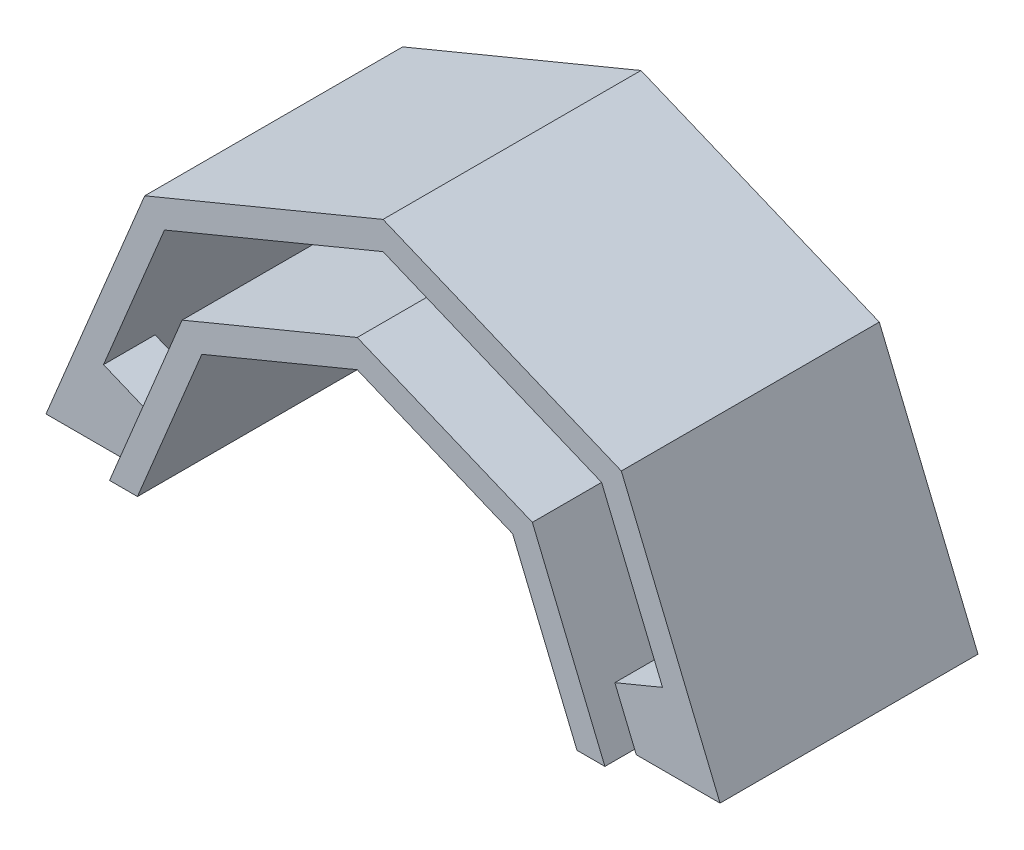
ISO-10303-21;
HEADER;
FILE_DESCRIPTION(('STEP AP214'),'2;1');
FILE_NAME('part.step','',(''),(''),'','','');
FILE_SCHEMA(('AUTOMOTIVE_DESIGN { 1 0 10303 214 1 1 1 1 }'));
ENDSEC;
DATA;
#1=APPLICATION_CONTEXT('core data for automotive mechanical design processes');
#2=APPLICATION_PROTOCOL_DEFINITION('international standard','automotive_design',2000,#1);
#3=PRODUCT_CONTEXT('',#1,'mechanical');
#4=PRODUCT('Part','Part','',(#3));
#5=PRODUCT_RELATED_PRODUCT_CATEGORY('part','',(#4));
#6=PRODUCT_DEFINITION_FORMATION('','',#4);
#7=PRODUCT_DEFINITION_CONTEXT('part definition',#1,'design');
#8=PRODUCT_DEFINITION('design','',#6,#7);
#9=PRODUCT_DEFINITION_SHAPE('','',#8);
#10=(LENGTH_UNIT() NAMED_UNIT(*) SI_UNIT(.MILLI.,.METRE.));
#11=(NAMED_UNIT(*) PLANE_ANGLE_UNIT() SI_UNIT($,.RADIAN.));
#12=(NAMED_UNIT(*) SI_UNIT($,.STERADIAN.) SOLID_ANGLE_UNIT());
#13=UNCERTAINTY_MEASURE_WITH_UNIT(LENGTH_MEASURE(1.E-05),#10,'distance_accuracy_value','');
#14=(GEOMETRIC_REPRESENTATION_CONTEXT(3) GLOBAL_UNCERTAINTY_ASSIGNED_CONTEXT((#13)) GLOBAL_UNIT_ASSIGNED_CONTEXT((#10,
#11,#12)) REPRESENTATION_CONTEXT('',''));
#15=CARTESIAN_POINT('',(0.,0.,0.));
#16=DIRECTION('',(0.,0.,1.));
#17=DIRECTION('',(1.,0.,0.));
#18=AXIS2_PLACEMENT_3D('',#15,#16,#17);
#19=CARTESIAN_POINT('',(0.,0.,2.54));
#20=DIRECTION('',(0.,0.,1.));
#21=DIRECTION('',(1.,0.,0.));
#22=AXIS2_PLACEMENT_3D('',#19,#20,#21);
#23=PLANE('',#22);
#24=DIRECTION('',(-1.,0.,0.));
#25=VECTOR('',#24,1.);
#26=CARTESIAN_POINT('',(-21.6397393151408,0.,2.54));
#27=LINE('',#26,#25);
#28=CARTESIAN_POINT('',(-21.6397393151408,0.,2.54));
#29=VERTEX_POINT('',#28);
#30=CARTESIAN_POINT('',(-29.8875678813688,0.,2.54));
#31=VERTEX_POINT('',#30);
#32=EDGE_CURVE('E251',#29,#31,#27,.T.);
#33=ORIENTED_EDGE('',*,*,#32,.T.);
#34=DIRECTION('',(0.382683432365091,0.923879532511286,0.));
#35=VECTOR('',#34,1.);
#36=CARTESIAN_POINT('',(-30.4725547276914,-1.41228317820205,2.54));
#37=LINE('',#36,#35);
#38=CARTESIAN_POINT('',(-27.0520445619796,6.84555885409439,2.54));
#39=VERTEX_POINT('',#38);
#40=EDGE_CURVE('E66',#31,#39,#37,.T.);
#41=ORIENTED_EDGE('',*,*,#40,.T.);
#42=DIRECTION('',(0.923879532511287,-0.38268343236509,0.));
#43=VECTOR('',#42,1.);
#44=CARTESIAN_POINT('',(-1.54140966025071,-3.72129210695017,2.54));
#45=LINE('',#44,#43);
#46=CARTESIAN_POINT('',(-22.3587365368223,4.90152701767973,2.54));
#47=VERTEX_POINT('',#46);
#48=EDGE_CURVE('E197',#39,#47,#45,.T.);
#49=ORIENTED_EDGE('',*,*,#48,.T.);
#50=DIRECTION('',(-0.38268343236509,-0.923879532511287,0.));
#51=VECTOR('',#50,1.);
#52=CARTESIAN_POINT('',(-17.2456382492599,17.2456382492598,2.54));
#53=LINE('',#52,#51);
#54=CARTESIAN_POINT('',(-17.2456382492599,17.2456382492598,2.54));
#55=VERTEX_POINT('',#54);
#56=EDGE_CURVE('E249',#55,#47,#53,.T.);
#57=ORIENTED_EDGE('',*,*,#56,.F.);
#58=DIRECTION('',(-0.923879532511285,-0.382683432365094,0.));
#59=VECTOR('',#58,1.);
#60=CARTESIAN_POINT('',(-1.21647483752874E-13,24.3890155038835,2.54));
#61=LINE('',#60,#59);
#62=CARTESIAN_POINT('',(-1.21647483752874E-13,24.3890155038835,2.54));
#63=VERTEX_POINT('',#62);
#64=EDGE_CURVE('E247',#63,#55,#61,.T.);
#65=ORIENTED_EDGE('',*,*,#64,.F.);
#66=DIRECTION('',(-0.923879532511286,0.382683432365091,0.));
#67=VECTOR('',#66,1.);
#68=CARTESIAN_POINT('',(17.2456382492597,17.2456382492598,2.54));
#69=LINE('',#68,#67);
#70=CARTESIAN_POINT('',(17.2456382492597,17.2456382492598,2.54));
#71=VERTEX_POINT('',#70);
#72=EDGE_CURVE('E245',#71,#63,#69,.T.);
#73=ORIENTED_EDGE('',*,*,#72,.F.);
#74=DIRECTION('',(-0.382683432365091,0.923879532511287,0.));
#75=VECTOR('',#74,1.);
#76=CARTESIAN_POINT('',(24.3890155038834,0.,2.54));
#77=LINE('',#76,#75);
#78=CARTESIAN_POINT('',(22.3587365368223,4.90152701767973,2.54));
#79=VERTEX_POINT('',#78);
#80=EDGE_CURVE('E243',#79,#71,#77,.T.);
#81=ORIENTED_EDGE('',*,*,#80,.F.);
#82=DIRECTION('',(-0.923879532511287,-0.38268343236509,0.));
#83=VECTOR('',#82,1.);
#84=CARTESIAN_POINT('',(1.54140966025071,-3.72129210695017,2.54));
#85=LINE('',#84,#83);
#86=CARTESIAN_POINT('',(27.0520445619796,6.84555885409439,2.54));
#87=VERTEX_POINT('',#86);
#88=EDGE_CURVE('E205',#87,#79,#85,.T.);
#89=ORIENTED_EDGE('',*,*,#88,.F.);
#90=DIRECTION('',(-0.382683432365091,0.923879532511286,0.));
#91=VECTOR('',#90,1.);
#92=CARTESIAN_POINT('',(30.4725547276914,-1.41228317820205,2.54));
#93=LINE('',#92,#91);
#94=CARTESIAN_POINT('',(29.8875678813688,0.,2.54));
#95=VERTEX_POINT('',#94);
#96=EDGE_CURVE('E210',#95,#87,#93,.T.);
#97=ORIENTED_EDGE('',*,*,#96,.F.);
#98=DIRECTION('',(1.,0.,0.));
#99=VECTOR('',#98,1.);
#100=CARTESIAN_POINT('',(21.6397393151407,0.,2.54));
#101=LINE('',#100,#99);
#102=CARTESIAN_POINT('',(21.6397393151407,0.,2.54));
#103=VERTEX_POINT('',#102);
#104=EDGE_CURVE('E212',#103,#95,#101,.T.);
#105=ORIENTED_EDGE('',*,*,#104,.F.);
#106=DIRECTION('',(-0.382683432365091,0.923879532511286,0.));
#107=VECTOR('',#106,1.);
#108=CARTESIAN_POINT('',(21.6397393151407,0.,2.54));
#109=LINE('',#108,#107);
#110=CARTESIAN_POINT('',(15.3016064128451,15.3016064128452,2.54));
#111=VERTEX_POINT('',#110);
#112=EDGE_CURVE('E219',#103,#111,#109,.T.);
#113=ORIENTED_EDGE('',*,*,#112,.T.);
#114=DIRECTION('',(-0.923879532511286,0.382683432365091,0.));
#115=VECTOR('',#114,1.);
#116=CARTESIAN_POINT('',(15.3016064128451,15.3016064128452,2.54));
#117=LINE('',#116,#115);
#118=CARTESIAN_POINT('',(-1.16443313324943E-13,21.6397393151408,2.54));
#119=VERTEX_POINT('',#118);
#120=EDGE_CURVE('E259',#111,#119,#117,.T.);
#121=ORIENTED_EDGE('',*,*,#120,.T.);
#122=DIRECTION('',(-0.923879532511285,-0.382683432365093,0.));
#123=VECTOR('',#122,1.);
#124=CARTESIAN_POINT('',(-1.16443313324943E-13,21.6397393151408,2.54));
#125=LINE('',#124,#123);
#126=CARTESIAN_POINT('',(-15.3016064128452,15.3016064128452,2.54));
#127=VERTEX_POINT('',#126);
#128=EDGE_CURVE('E256',#119,#127,#125,.T.);
#129=ORIENTED_EDGE('',*,*,#128,.T.);
#130=DIRECTION('',(-0.38268343236509,-0.923879532511287,0.));
#131=VECTOR('',#130,1.);
#132=CARTESIAN_POINT('',(-15.3016064128452,15.3016064128452,2.54));
#133=LINE('',#132,#131);
#134=EDGE_CURVE('E253',#127,#29,#133,.T.);
#135=ORIENTED_EDGE('',*,*,#134,.T.);
#136=EDGE_LOOP('',(#33,#41,#49,#57,#65,#73,#81,#89,#97,#105,#113,#121,#129,#135));
#137=FACE_BOUND('',#136,.T.);
#138=ADVANCED_FACE('F51',(#137),#23,.F.);
#139=CARTESIAN_POINT('',(-30.4725547276914,-1.41228317820205,7.62));
#140=DIRECTION('',(0.,0.,-1.));
#141=DIRECTION('',(-1.,0.,0.));
#142=AXIS2_PLACEMENT_3D('',#139,#140,#141);
#143=PLANE('',#142);
#144=DIRECTION('',(1.,0.,0.));
#145=VECTOR('',#144,1.);
#146=CARTESIAN_POINT('',(-30.9213154832246,0.,7.62));
#147=LINE('',#146,#145);
#148=CARTESIAN_POINT('',(-29.8875678813688,0.,7.62));
#149=VERTEX_POINT('',#148);
#150=CARTESIAN_POINT('',(-24.3890155038834,0.,7.62));
#151=VERTEX_POINT('',#150);
#152=EDGE_CURVE('E167',#149,#151,#147,.T.);
#153=ORIENTED_EDGE('',*,*,#152,.T.);
#154=DIRECTION('',(0.382683432365091,0.923879532511286,0.));
#155=VECTOR('',#154,1.);
#156=CARTESIAN_POINT('',(-25.7792467025341,-3.35631501461671,7.62));
#157=LINE('',#156,#155);
#158=CARTESIAN_POINT('',(-22.3587365368223,4.90152701767973,7.62));
#159=VERTEX_POINT('',#158);
#160=EDGE_CURVE('E193',#151,#159,#157,.T.);
#161=ORIENTED_EDGE('',*,*,#160,.T.);
#162=DIRECTION('',(0.923879532511287,-0.38268343236509,0.));
#163=VECTOR('',#162,1.);
#164=CARTESIAN_POINT('',(-27.5213753644954,7.03996203773587,7.62));
#165=LINE('',#164,#163);
#166=CARTESIAN_POINT('',(-27.0520445619796,6.84555885409439,7.62));
#167=VERTEX_POINT('',#166);
#168=EDGE_CURVE('E184',#167,#159,#165,.T.);
#169=ORIENTED_EDGE('',*,*,#168,.F.);
#170=DIRECTION('',(0.382683432365091,0.923879532511286,0.));
#171=VECTOR('',#170,1.);
#172=CARTESIAN_POINT('',(-30.4725547276914,-1.41228317820205,7.62));
#173=LINE('',#172,#171);
#174=EDGE_CURVE('E182',#149,#167,#173,.T.);
#175=ORIENTED_EDGE('',*,*,#174,.F.);
#176=EDGE_LOOP('',(#153,#161,#169,#175));
#177=FACE_BOUND('',#176,.T.);
#178=ADVANCED_FACE('F187',(#177),#143,.F.);
#179=CARTESIAN_POINT('',(-25.5106349017289,10.5668509610446,0.));
#180=DIRECTION('',(0.923879532511286,-0.382683432365091,0.));
#181=DIRECTION('',(-0.382683432365091,-0.923879532511286,0.));
#182=AXIS2_PLACEMENT_3D('',#179,#180,#181);
#183=PLANE('',#182);
#184=DIRECTION('',(0.,0.,-1.));
#185=VECTOR('',#184,1.);
#186=CARTESIAN_POINT('',(-29.8875678813688,0.,0.));
#187=LINE('',#186,#185);
#188=EDGE_CURVE('E171',#149,#31,#187,.T.);
#189=ORIENTED_EDGE('',*,*,#188,.F.);
#190=ORIENTED_EDGE('',*,*,#174,.T.);
#191=DIRECTION('',(0.,0.,-1.));
#192=VECTOR('',#191,1.);
#193=CARTESIAN_POINT('',(-27.0520445619796,6.84555885409439,0.));
#194=LINE('',#193,#192);
#195=EDGE_CURVE('E12',#167,#39,#194,.T.);
#196=ORIENTED_EDGE('',*,*,#195,.T.);
#197=ORIENTED_EDGE('',*,*,#40,.F.);
#198=EDGE_LOOP('',(#189,#190,#196,#197));
#199=FACE_BOUND('',#198,.T.);
#200=ADVANCED_FACE('F181',(#199),#183,.F.);
#201=CARTESIAN_POINT('',(-17.2456382492599,17.2456382492598,27.94));
#202=DIRECTION('',(0.923879532511287,-0.38268343236509,0.));
#203=DIRECTION('',(0.38268343236509,0.923879532511287,0.));
#204=AXIS2_PLACEMENT_3D('',#201,#202,#203);
#205=PLANE('',#204);
#206=ORIENTED_EDGE('',*,*,#56,.T.);
#207=DIRECTION('',(0.,0.,1.));
#208=VECTOR('',#207,1.);
#209=CARTESIAN_POINT('',(-22.3587365368223,4.90152701767973,-34.544));
#210=LINE('',#209,#208);
#211=EDGE_CURVE('E334',#47,#159,#210,.T.);
#212=ORIENTED_EDGE('',*,*,#211,.T.);
#213=ORIENTED_EDGE('',*,*,#160,.F.);
#214=DIRECTION('',(0.,0.,-1.));
#215=VECTOR('',#214,1.);
#216=CARTESIAN_POINT('',(-24.3890155038835,0.,27.94));
#217=LINE('',#216,#215);
#218=CARTESIAN_POINT('',(-24.3890155038835,0.,27.94));
#219=VERTEX_POINT('',#218);
#220=EDGE_CURVE('E174',#219,#151,#217,.T.);
#221=ORIENTED_EDGE('',*,*,#220,.F.);
#222=DIRECTION('',(-0.38268343236509,-0.923879532511287,0.));
#223=VECTOR('',#222,1.);
#224=CARTESIAN_POINT('',(-17.2456382492599,17.2456382492598,27.94));
#225=LINE('',#224,#223);
#226=CARTESIAN_POINT('',(-17.2456382492599,17.2456382492598,27.94));
#227=VERTEX_POINT('',#226);
#228=EDGE_CURVE('E225',#227,#219,#225,.T.);
#229=ORIENTED_EDGE('',*,*,#228,.F.);
#230=DIRECTION('',(0.,0.,-1.));
#231=VECTOR('',#230,1.);
#232=CARTESIAN_POINT('',(-17.2456382492599,17.2456382492598,27.94));
#233=LINE('',#232,#231);
#234=EDGE_CURVE('E274',#227,#55,#233,.T.);
#235=ORIENTED_EDGE('',*,*,#234,.T.);
#236=EDGE_LOOP('',(#206,#212,#213,#221,#229,#235));
#237=FACE_BOUND('',#236,.T.);
#238=ADVANCED_FACE('F332',(#237),#205,.F.);
#239=CARTESIAN_POINT('',(30.4725547276914,-1.41228317820205,7.62));
#240=DIRECTION('',(0.,0.,1.));
#241=DIRECTION('',(1.,0.,0.));
#242=AXIS2_PLACEMENT_3D('',#239,#240,#241);
#243=PLANE('',#242);
#244=DIRECTION('',(-1.,0.,0.));
#245=VECTOR('',#244,1.);
#246=CARTESIAN_POINT('',(30.9213154832246,0.,7.62));
#247=LINE('',#246,#245);
#248=CARTESIAN_POINT('',(29.8875678813688,0.,7.62));
#249=VERTEX_POINT('',#248);
#250=CARTESIAN_POINT('',(24.3890155038834,0.,7.62));
#251=VERTEX_POINT('',#250);
#252=EDGE_CURVE('E189',#249,#251,#247,.T.);
#253=ORIENTED_EDGE('',*,*,#252,.F.);
#254=DIRECTION('',(-0.382683432365091,0.923879532511286,0.));
#255=VECTOR('',#254,1.);
#256=CARTESIAN_POINT('',(30.4725547276914,-1.41228317820205,7.62));
#257=LINE('',#256,#255);
#258=CARTESIAN_POINT('',(27.0520445619796,6.84555885409439,7.62));
#259=VERTEX_POINT('',#258);
#260=EDGE_CURVE('E74',#249,#259,#257,.T.);
#261=ORIENTED_EDGE('',*,*,#260,.T.);
#262=DIRECTION('',(-0.923879532511287,-0.38268343236509,0.));
#263=VECTOR('',#262,1.);
#264=CARTESIAN_POINT('',(27.5213753644954,7.03996203773587,7.62));
#265=LINE('',#264,#263);
#266=CARTESIAN_POINT('',(22.3587365368223,4.90152701767973,7.62));
#267=VERTEX_POINT('',#266);
#268=EDGE_CURVE('E201',#259,#267,#265,.T.);
#269=ORIENTED_EDGE('',*,*,#268,.T.);
#270=DIRECTION('',(-0.382683432365091,0.923879532511286,0.));
#271=VECTOR('',#270,1.);
#272=CARTESIAN_POINT('',(25.7792467025341,-3.35631501461671,7.62));
#273=LINE('',#272,#271);
#274=EDGE_CURVE('E208',#251,#267,#273,.T.);
#275=ORIENTED_EDGE('',*,*,#274,.F.);
#276=EDGE_LOOP('',(#253,#261,#269,#275));
#277=FACE_BOUND('',#276,.T.);
#278=ADVANCED_FACE('F312',(#277),#243,.T.);
#279=CARTESIAN_POINT('',(25.5106349017289,10.5668509610446,0.));
#280=DIRECTION('',(-0.923879532511286,-0.382683432365091,0.));
#281=DIRECTION('',(0.382683432365091,-0.923879532511286,0.));
#282=AXIS2_PLACEMENT_3D('',#279,#280,#281);
#283=PLANE('',#282);
#284=ORIENTED_EDGE('',*,*,#260,.F.);
#285=DIRECTION('',(0.,0.,-1.));
#286=VECTOR('',#285,1.);
#287=CARTESIAN_POINT('',(29.8875678813688,0.,0.));
#288=LINE('',#287,#286);
#289=EDGE_CURVE('E191',#249,#95,#288,.T.);
#290=ORIENTED_EDGE('',*,*,#289,.T.);
#291=ORIENTED_EDGE('',*,*,#96,.T.);
#292=DIRECTION('',(0.,0.,-1.));
#293=VECTOR('',#292,1.);
#294=CARTESIAN_POINT('',(27.0520445619796,6.84555885409439,0.));
#295=LINE('',#294,#293);
#296=EDGE_CURVE('E59',#259,#87,#295,.T.);
#297=ORIENTED_EDGE('',*,*,#296,.F.);
#298=EDGE_LOOP('',(#284,#290,#291,#297));
#299=FACE_BOUND('',#298,.T.);
#300=ADVANCED_FACE('F313',(#299),#283,.F.);
#301=CARTESIAN_POINT('',(24.3890155038834,0.,27.94));
#302=DIRECTION('',(-0.923879532511286,-0.382683432365091,0.));
#303=DIRECTION('',(0.382683432365091,-0.923879532511287,0.));
#304=AXIS2_PLACEMENT_3D('',#301,#302,#303);
#305=PLANE('',#304);
#306=ORIENTED_EDGE('',*,*,#80,.T.);
#307=DIRECTION('',(0.,0.,-1.));
#308=VECTOR('',#307,1.);
#309=CARTESIAN_POINT('',(17.2456382492597,17.2456382492598,27.94));
#310=LINE('',#309,#308);
#311=CARTESIAN_POINT('',(17.2456382492597,17.2456382492598,27.94));
#312=VERTEX_POINT('',#311);
#313=EDGE_CURVE('E280',#312,#71,#310,.T.);
#314=ORIENTED_EDGE('',*,*,#313,.F.);
#315=DIRECTION('',(-0.382683432365091,0.923879532511287,0.));
#316=VECTOR('',#315,1.);
#317=CARTESIAN_POINT('',(24.3890155038834,0.,27.94));
#318=LINE('',#317,#316);
#319=CARTESIAN_POINT('',(24.3890155038834,0.,27.94));
#320=VERTEX_POINT('',#319);
#321=EDGE_CURVE('E218',#320,#312,#318,.T.);
#322=ORIENTED_EDGE('',*,*,#321,.F.);
#323=DIRECTION('',(0.,0.,-1.));
#324=VECTOR('',#323,1.);
#325=CARTESIAN_POINT('',(24.3890155038834,0.,27.94));
#326=LINE('',#325,#324);
#327=EDGE_CURVE('E283',#320,#251,#326,.T.);
#328=ORIENTED_EDGE('',*,*,#327,.T.);
#329=ORIENTED_EDGE('',*,*,#274,.T.);
#330=DIRECTION('',(0.,0.,1.));
#331=VECTOR('',#330,1.);
#332=CARTESIAN_POINT('',(22.3587365368223,4.90152701767973,-34.544));
#333=LINE('',#332,#331);
#334=EDGE_CURVE('E203',#79,#267,#333,.T.);
#335=ORIENTED_EDGE('',*,*,#334,.F.);
#336=EDGE_LOOP('',(#306,#314,#322,#328,#329,#335));
#337=FACE_BOUND('',#336,.T.);
#338=ADVANCED_FACE('F298',(#337),#305,.F.);
#339=CARTESIAN_POINT('',(21.6397393151407,0.,27.94));
#340=DIRECTION('',(0.,1.,0.));
#341=DIRECTION('',(0.,0.,1.));
#342=AXIS2_PLACEMENT_3D('',#339,#340,#341);
#343=PLANE('',#342);
#344=ORIENTED_EDGE('',*,*,#104,.T.);
#345=ORIENTED_EDGE('',*,*,#289,.F.);
#346=ORIENTED_EDGE('',*,*,#252,.T.);
#347=ORIENTED_EDGE('',*,*,#327,.F.);
#348=DIRECTION('',(1.,0.,0.));
#349=VECTOR('',#348,1.);
#350=CARTESIAN_POINT('',(21.6397393151407,0.,27.94));
#351=LINE('',#350,#349);
#352=CARTESIAN_POINT('',(21.6397393151407,0.,27.94));
#353=VERTEX_POINT('',#352);
#354=EDGE_CURVE('E215',#353,#320,#351,.T.);
#355=ORIENTED_EDGE('',*,*,#354,.F.);
#356=DIRECTION('',(0.,0.,-1.));
#357=VECTOR('',#356,1.);
#358=CARTESIAN_POINT('',(21.6397393151407,0.,27.94));
#359=LINE('',#358,#357);
#360=EDGE_CURVE('E241',#353,#103,#359,.T.);
#361=ORIENTED_EDGE('',*,*,#360,.T.);
#362=EDGE_LOOP('',(#344,#345,#346,#347,#355,#361));
#363=FACE_BOUND('',#362,.T.);
#364=ADVANCED_FACE('F53',(#363),#343,.F.);
#365=CARTESIAN_POINT('',(17.2456382492597,17.2456382492598,27.94));
#366=DIRECTION('',(-0.382683432365091,-0.923879532511286,0.));
#367=DIRECTION('',(0.923879532511286,-0.382683432365091,0.));
#368=AXIS2_PLACEMENT_3D('',#365,#366,#367);
#369=PLANE('',#368);
#370=ORIENTED_EDGE('',*,*,#72,.T.);
#371=DIRECTION('',(0.,0.,-1.));
#372=VECTOR('',#371,1.);
#373=CARTESIAN_POINT('',(-1.21647483752874E-13,24.3890155038835,27.94));
#374=LINE('',#373,#372);
#375=CARTESIAN_POINT('',(-1.21647483752874E-13,24.3890155038835,27.94));
#376=VERTEX_POINT('',#375);
#377=EDGE_CURVE('E277',#376,#63,#374,.T.);
#378=ORIENTED_EDGE('',*,*,#377,.F.);
#379=DIRECTION('',(-0.923879532511286,0.382683432365091,0.));
#380=VECTOR('',#379,1.);
#381=CARTESIAN_POINT('',(17.2456382492597,17.2456382492598,27.94));
#382=LINE('',#381,#380);
#383=EDGE_CURVE('E221',#312,#376,#382,.T.);
#384=ORIENTED_EDGE('',*,*,#383,.F.);
#385=ORIENTED_EDGE('',*,*,#313,.T.);
#386=EDGE_LOOP('',(#370,#378,#384,#385));
#387=FACE_BOUND('',#386,.T.);
#388=ADVANCED_FACE('F301',(#387),#369,.F.);
#389=CARTESIAN_POINT('',(-1.21647483752874E-13,24.3890155038835,27.94));
#390=DIRECTION('',(0.382683432365093,-0.923879532511285,0.));
#391=DIRECTION('',(0.923879532511285,0.382683432365094,0.));
#392=AXIS2_PLACEMENT_3D('',#389,#390,#391);
#393=PLANE('',#392);
#394=ORIENTED_EDGE('',*,*,#64,.T.);
#395=ORIENTED_EDGE('',*,*,#234,.F.);
#396=DIRECTION('',(-0.923879532511285,-0.382683432365094,0.));
#397=VECTOR('',#396,1.);
#398=CARTESIAN_POINT('',(-1.21647483752874E-13,24.3890155038835,27.94));
#399=LINE('',#398,#397);
#400=EDGE_CURVE('E223',#376,#227,#399,.T.);
#401=ORIENTED_EDGE('',*,*,#400,.F.);
#402=ORIENTED_EDGE('',*,*,#377,.T.);
#403=EDGE_LOOP('',(#394,#395,#401,#402));
#404=FACE_BOUND('',#403,.T.);
#405=ADVANCED_FACE('F341',(#404),#393,.F.);
#406=CARTESIAN_POINT('',(-21.6397393151408,0.,27.94));
#407=DIRECTION('',(0.,-1.,0.));
#408=DIRECTION('',(0.,0.,-1.));
#409=AXIS2_PLACEMENT_3D('',#406,#407,#408);
#410=PLANE('',#409);
#411=ORIENTED_EDGE('',*,*,#32,.F.);
#412=DIRECTION('',(0.,0.,-1.));
#413=VECTOR('',#412,1.);
#414=CARTESIAN_POINT('',(-21.6397393151408,0.,27.94));
#415=LINE('',#414,#413);
#416=CARTESIAN_POINT('',(-21.6397393151408,0.,27.94));
#417=VERTEX_POINT('',#416);
#418=EDGE_CURVE('E271',#417,#29,#415,.T.);
#419=ORIENTED_EDGE('',*,*,#418,.F.);
#420=DIRECTION('',(-1.,0.,0.));
#421=VECTOR('',#420,1.);
#422=CARTESIAN_POINT('',(-21.6397393151408,0.,27.94));
#423=LINE('',#422,#421);
#424=EDGE_CURVE('E227',#417,#219,#423,.T.);
#425=ORIENTED_EDGE('',*,*,#424,.T.);
#426=ORIENTED_EDGE('',*,*,#220,.T.);
#427=ORIENTED_EDGE('',*,*,#152,.F.);
#428=ORIENTED_EDGE('',*,*,#188,.T.);
#429=EDGE_LOOP('',(#411,#419,#425,#426,#427,#428));
#430=FACE_BOUND('',#429,.T.);
#431=ADVANCED_FACE('F170',(#430),#410,.T.);
#432=CARTESIAN_POINT('',(-15.3016064128452,15.3016064128452,27.94));
#433=DIRECTION('',(0.923879532511287,-0.38268343236509,0.));
#434=DIRECTION('',(0.38268343236509,0.923879532511287,0.));
#435=AXIS2_PLACEMENT_3D('',#432,#433,#434);
#436=PLANE('',#435);
#437=ORIENTED_EDGE('',*,*,#134,.F.);
#438=DIRECTION('',(0.,0.,-1.));
#439=VECTOR('',#438,1.);
#440=CARTESIAN_POINT('',(-15.3016064128452,15.3016064128452,27.94));
#441=LINE('',#440,#439);
#442=CARTESIAN_POINT('',(-15.3016064128452,15.3016064128452,27.94));
#443=VERTEX_POINT('',#442);
#444=EDGE_CURVE('E269',#443,#127,#441,.T.);
#445=ORIENTED_EDGE('',*,*,#444,.F.);
#446=DIRECTION('',(-0.38268343236509,-0.923879532511287,0.));
#447=VECTOR('',#446,1.);
#448=CARTESIAN_POINT('',(-15.3016064128452,15.3016064128452,27.94));
#449=LINE('',#448,#447);
#450=EDGE_CURVE('E229',#443,#417,#449,.T.);
#451=ORIENTED_EDGE('',*,*,#450,.T.);
#452=ORIENTED_EDGE('',*,*,#418,.T.);
#453=EDGE_LOOP('',(#437,#445,#451,#452));
#454=FACE_BOUND('',#453,.T.);
#455=ADVANCED_FACE('F328',(#454),#436,.T.);
#456=CARTESIAN_POINT('',(-1.16443313324943E-13,21.6397393151408,27.94));
#457=DIRECTION('',(0.382683432365093,-0.923879532511285,0.));
#458=DIRECTION('',(0.923879532511285,0.382683432365093,0.));
#459=AXIS2_PLACEMENT_3D('',#456,#457,#458);
#460=PLANE('',#459);
#461=ORIENTED_EDGE('',*,*,#128,.F.);
#462=DIRECTION('',(0.,0.,-1.));
#463=VECTOR('',#462,1.);
#464=CARTESIAN_POINT('',(-1.16443313324943E-13,21.6397393151408,27.94));
#465=LINE('',#464,#463);
#466=CARTESIAN_POINT('',(-1.16443313324943E-13,21.6397393151408,27.94));
#467=VERTEX_POINT('',#466);
#468=EDGE_CURVE('E267',#467,#119,#465,.T.);
#469=ORIENTED_EDGE('',*,*,#468,.F.);
#470=DIRECTION('',(-0.923879532511285,-0.382683432365093,0.));
#471=VECTOR('',#470,1.);
#472=CARTESIAN_POINT('',(-1.16443313324943E-13,21.6397393151408,27.94));
#473=LINE('',#472,#471);
#474=EDGE_CURVE('E232',#467,#443,#473,.T.);
#475=ORIENTED_EDGE('',*,*,#474,.T.);
#476=ORIENTED_EDGE('',*,*,#444,.T.);
#477=EDGE_LOOP('',(#461,#469,#475,#476));
#478=FACE_BOUND('',#477,.T.);
#479=ADVANCED_FACE('F324',(#478),#460,.T.);
#480=CARTESIAN_POINT('',(15.3016064128451,15.3016064128452,27.94));
#481=DIRECTION('',(-0.382683432365091,-0.923879532511286,0.));
#482=DIRECTION('',(0.923879532511286,-0.382683432365091,0.));
#483=AXIS2_PLACEMENT_3D('',#480,#481,#482);
#484=PLANE('',#483);
#485=ORIENTED_EDGE('',*,*,#120,.F.);
#486=DIRECTION('',(0.,0.,-1.));
#487=VECTOR('',#486,1.);
#488=CARTESIAN_POINT('',(15.3016064128451,15.3016064128452,27.94));
#489=LINE('',#488,#487);
#490=CARTESIAN_POINT('',(15.3016064128451,15.3016064128452,27.94));
#491=VERTEX_POINT('',#490);
#492=EDGE_CURVE('E265',#491,#111,#489,.T.);
#493=ORIENTED_EDGE('',*,*,#492,.F.);
#494=DIRECTION('',(-0.923879532511286,0.382683432365091,0.));
#495=VECTOR('',#494,1.);
#496=CARTESIAN_POINT('',(15.3016064128451,15.3016064128452,27.94));
#497=LINE('',#496,#495);
#498=EDGE_CURVE('E235',#491,#467,#497,.T.);
#499=ORIENTED_EDGE('',*,*,#498,.T.);
#500=ORIENTED_EDGE('',*,*,#468,.T.);
#501=EDGE_LOOP('',(#485,#493,#499,#500));
#502=FACE_BOUND('',#501,.T.);
#503=ADVANCED_FACE('F320',(#502),#484,.T.);
#504=CARTESIAN_POINT('',(21.6397393151407,0.,27.94));
#505=DIRECTION('',(-0.923879532511286,-0.382683432365091,0.));
#506=DIRECTION('',(0.382683432365091,-0.923879532511286,0.));
#507=AXIS2_PLACEMENT_3D('',#504,#505,#506);
#508=PLANE('',#507);
#509=ORIENTED_EDGE('',*,*,#112,.F.);
#510=ORIENTED_EDGE('',*,*,#360,.F.);
#511=DIRECTION('',(-0.382683432365091,0.923879532511286,0.));
#512=VECTOR('',#511,1.);
#513=CARTESIAN_POINT('',(21.6397393151407,0.,27.94));
#514=LINE('',#513,#512);
#515=EDGE_CURVE('E238',#353,#491,#514,.T.);
#516=ORIENTED_EDGE('',*,*,#515,.T.);
#517=ORIENTED_EDGE('',*,*,#492,.T.);
#518=EDGE_LOOP('',(#509,#510,#516,#517));
#519=FACE_BOUND('',#518,.T.);
#520=ADVANCED_FACE('F316',(#519),#508,.T.);
#521=CARTESIAN_POINT('',(0.,0.,27.94));
#522=DIRECTION('',(0.,0.,1.));
#523=DIRECTION('',(1.,0.,0.));
#524=AXIS2_PLACEMENT_3D('',#521,#522,#523);
#525=PLANE('',#524);
#526=ORIENTED_EDGE('',*,*,#354,.T.);
#527=ORIENTED_EDGE('',*,*,#321,.T.);
#528=ORIENTED_EDGE('',*,*,#383,.T.);
#529=ORIENTED_EDGE('',*,*,#400,.T.);
#530=ORIENTED_EDGE('',*,*,#228,.T.);
#531=ORIENTED_EDGE('',*,*,#424,.F.);
#532=ORIENTED_EDGE('',*,*,#450,.F.);
#533=ORIENTED_EDGE('',*,*,#474,.F.);
#534=ORIENTED_EDGE('',*,*,#498,.F.);
#535=ORIENTED_EDGE('',*,*,#515,.F.);
#536=EDGE_LOOP('',(#526,#527,#528,#529,#530,#531,#532,#533,#534,#535));
#537=FACE_BOUND('',#536,.T.);
#538=ADVANCED_FACE('F305',(#537),#525,.T.);
#539=CARTESIAN_POINT('',(27.5213753644954,7.03996203773587,-34.544));
#540=DIRECTION('',(-0.38268343236509,0.923879532511287,0.));
#541=DIRECTION('',(-0.923879532511287,-0.38268343236509,0.));
#542=AXIS2_PLACEMENT_3D('',#539,#540,#541);
#543=PLANE('',#542);
#544=ORIENTED_EDGE('',*,*,#88,.T.);
#545=ORIENTED_EDGE('',*,*,#334,.T.);
#546=ORIENTED_EDGE('',*,*,#268,.F.);
#547=ORIENTED_EDGE('',*,*,#296,.T.);
#548=EDGE_LOOP('',(#544,#545,#546,#547));
#549=FACE_BOUND('',#548,.T.);
#550=ADVANCED_FACE('F289',(#549),#543,.T.);
#551=CARTESIAN_POINT('',(-27.5213753644954,7.03996203773587,-34.544));
#552=DIRECTION('',(-0.38268343236509,-0.923879532511287,0.));
#553=DIRECTION('',(0.923879532511287,-0.38268343236509,0.));
#554=AXIS2_PLACEMENT_3D('',#551,#552,#553);
#555=PLANE('',#554);
#556=ORIENTED_EDGE('',*,*,#195,.F.);
#557=ORIENTED_EDGE('',*,*,#168,.T.);
#558=ORIENTED_EDGE('',*,*,#211,.F.);
#559=ORIENTED_EDGE('',*,*,#48,.F.);
#560=EDGE_LOOP('',(#556,#557,#558,#559));
#561=FACE_BOUND('',#560,.T.);
#562=ADVANCED_FACE('F338',(#561),#555,.F.);
#563=CLOSED_SHELL('',(#138,#178,#200,#238,#278,#300,#338,#364,#388,#405,#431,#455,#479,#503,
#520,#538,#550,#562));
#564=MANIFOLD_SOLID_BREP('B2',#563);
#565=CARTESIAN_POINT('',(0.,0.,25.4));
#566=DIRECTION('',(0.,0.,1.));
#567=DIRECTION('',(1.,0.,0.));
#568=AXIS2_PLACEMENT_3D('',#565,#566,#567);
#569=PLANE('',#568);
#570=DIRECTION('',(0.382683432365086,-0.923879532511288,0.));
#571=VECTOR('',#570,1.);
#572=CARTESIAN_POINT('',(25.74411509396,-1.94403183641479,25.4));
#573=LINE('',#572,#571);
#574=CARTESIAN_POINT('',(22.828067339338,5.09593020132123,25.4));
#575=VERTEX_POINT('',#574);
#576=CARTESIAN_POINT('',(24.9388707416319,0.,25.4));
#577=VERTEX_POINT('',#576);
#578=EDGE_CURVE('E637',#575,#577,#573,.T.);
#579=ORIENTED_EDGE('',*,*,#578,.T.);
#580=DIRECTION('',(1.,0.,0.));
#581=VECTOR('',#580,1.);
#582=CARTESIAN_POINT('',(30.4374231191173,-1.50042381001198E-13,25.4));
#583=LINE('',#582,#581);
#584=CARTESIAN_POINT('',(33.18669930786,0.,25.4));
#585=VERTEX_POINT('',#584);
#586=EDGE_CURVE('E519',#577,#585,#583,.T.);
#587=ORIENTED_EDGE('',*,*,#586,.T.);
#588=DIRECTION('',(-0.382683432365091,0.923879532511287,0.));
#589=VECTOR('',#588,1.);
#590=CARTESIAN_POINT('',(33.18669930786,0.,25.4));
#591=LINE('',#590,#589);
#592=CARTESIAN_POINT('',(23.4665401257866,23.4665401257867,25.4));
#593=VERTEX_POINT('',#592);
#594=EDGE_CURVE('E673',#585,#593,#591,.T.);
#595=ORIENTED_EDGE('',*,*,#594,.T.);
#596=DIRECTION('',(-0.923879532511286,0.382683432365091,0.));
#597=VECTOR('',#596,1.);
#598=CARTESIAN_POINT('',(23.4665401257866,23.4665401257867,25.4));
#599=LINE('',#598,#597);
#600=CARTESIAN_POINT('',(-1.30646361784503E-13,33.1866993078601,25.4));
#601=VERTEX_POINT('',#600);
#602=EDGE_CURVE('E675',#593,#601,#599,.T.);
#603=ORIENTED_EDGE('',*,*,#602,.T.);
#604=DIRECTION('',(-0.923879532511285,-0.382683432365094,0.));
#605=VECTOR('',#604,1.);
#606=CARTESIAN_POINT('',(-1.30646361784503E-13,33.1866993078601,25.4));
#607=LINE('',#606,#605);
#608=CARTESIAN_POINT('',(-23.4665401257868,23.4665401257867,25.4));
#609=VERTEX_POINT('',#608);
#610=EDGE_CURVE('E677',#601,#609,#607,.T.);
#611=ORIENTED_EDGE('',*,*,#610,.T.);
#612=DIRECTION('',(-0.38268343236509,-0.923879532511287,0.));
#613=VECTOR('',#612,1.);
#614=CARTESIAN_POINT('',(-23.4665401257868,23.4665401257867,25.4));
#615=LINE('',#614,#613);
#616=CARTESIAN_POINT('',(-33.1866993078601,0.,25.4));
#617=VERTEX_POINT('',#616);
#618=EDGE_CURVE('E679',#609,#617,#615,.T.);
#619=ORIENTED_EDGE('',*,*,#618,.T.);
#620=DIRECTION('',(-1.,0.,0.));
#621=VECTOR('',#620,1.);
#622=CARTESIAN_POINT('',(-30.4374231191173,-1.50042381001198E-13,25.4));
#623=LINE('',#622,#621);
#624=CARTESIAN_POINT('',(-24.9388707416319,0.,25.4));
#625=VERTEX_POINT('',#624);
#626=EDGE_CURVE('E681',#625,#617,#623,.T.);
#627=ORIENTED_EDGE('',*,*,#626,.F.);
#628=DIRECTION('',(-0.382683432365086,-0.923879532511288,0.));
#629=VECTOR('',#628,1.);
#630=CARTESIAN_POINT('',(-25.74411509396,-1.94403183641479,25.4));
#631=LINE('',#630,#629);
#632=CARTESIAN_POINT('',(-22.828067339338,5.09593020132123,25.4));
#633=VERTEX_POINT('',#632);
#634=EDGE_CURVE('E653',#633,#625,#631,.T.);
#635=ORIENTED_EDGE('',*,*,#634,.F.);
#636=DIRECTION('',(-0.923879532511289,0.382683432365086,0.));
#637=VECTOR('',#636,1.);
#638=CARTESIAN_POINT('',(-22.828067339338,5.09593020132123,25.4));
#639=LINE('',#638,#637);
#640=CARTESIAN_POINT('',(-27.5213753644954,7.03996203773586,25.4));
#641=VERTEX_POINT('',#640);
#642=EDGE_CURVE('E661',#633,#641,#639,.T.);
#643=ORIENTED_EDGE('',*,*,#642,.T.);
#644=DIRECTION('',(-0.382683432365086,-0.923879532511289,0.));
#645=VECTOR('',#644,1.);
#646=CARTESIAN_POINT('',(-21.5225082893721,21.522508289372,25.4));
#647=LINE('',#646,#645);
#648=CARTESIAN_POINT('',(-21.5225082893721,21.522508289372,25.4));
#649=VERTEX_POINT('',#648);
#650=EDGE_CURVE('E684',#649,#641,#647,.T.);
#651=ORIENTED_EDGE('',*,*,#650,.F.);
#652=DIRECTION('',(-0.923879532511285,-0.382683432365093,0.));
#653=VECTOR('',#652,1.);
#654=CARTESIAN_POINT('',(-1.52764086103208E-13,30.4374231191174,25.4));
#655=LINE('',#654,#653);
#656=CARTESIAN_POINT('',(-1.52764086103208E-13,30.4374231191174,25.4));
#657=VERTEX_POINT('',#656);
#658=EDGE_CURVE('E686',#657,#649,#655,.T.);
#659=ORIENTED_EDGE('',*,*,#658,.F.);
#660=DIRECTION('',(-0.923879532511287,0.38268343236509,0.));
#661=VECTOR('',#660,1.);
#662=CARTESIAN_POINT('',(21.5225082893719,21.5225082893721,25.4));
#663=LINE('',#662,#661);
#664=CARTESIAN_POINT('',(21.5225082893719,21.5225082893721,25.4));
#665=VERTEX_POINT('',#664);
#666=EDGE_CURVE('E689',#665,#657,#663,.T.);
#667=ORIENTED_EDGE('',*,*,#666,.F.);
#668=DIRECTION('',(-0.382683432365093,0.923879532511285,0.));
#669=VECTOR('',#668,1.);
#670=CARTESIAN_POINT('',(30.4374231191173,-1.50042381001198E-13,25.4));
#671=LINE('',#670,#669);
#672=CARTESIAN_POINT('',(27.5213753644954,7.03996203773587,25.4));
#673=VERTEX_POINT('',#672);
#674=EDGE_CURVE('E631',#673,#665,#671,.T.);
#675=ORIENTED_EDGE('',*,*,#674,.F.);
#676=DIRECTION('',(0.923879532511289,0.382683432365086,0.));
#677=VECTOR('',#676,1.);
#678=CARTESIAN_POINT('',(22.828067339338,5.09593020132123,25.4));
#679=LINE('',#678,#677);
#680=EDGE_CURVE('E646',#575,#673,#679,.T.);
#681=ORIENTED_EDGE('',*,*,#680,.F.);
#682=EDGE_LOOP('',(#579,#587,#595,#603,#611,#619,#627,#635,#643,#651,#659,#667,#675,#681));
#683=FACE_BOUND('',#682,.T.);
#684=ADVANCED_FACE('F505',(#683),#569,.T.);
#685=CARTESIAN_POINT('',(25.74411509396,-1.94403183641479,20.32));
#686=DIRECTION('',(0.,0.,-1.));
#687=DIRECTION('',(-1.,0.,0.));
#688=AXIS2_PLACEMENT_3D('',#685,#686,#687);
#689=PLANE('',#688);
#690=DIRECTION('',(-0.382683432365086,0.923879532511288,0.));
#691=VECTOR('',#690,1.);
#692=CARTESIAN_POINT('',(30.4374231191173,-1.49186218934005E-13,20.32));
#693=LINE('',#692,#691);
#694=CARTESIAN_POINT('',(30.4374231191173,-1.49186218934005E-13,20.32));
#695=VERTEX_POINT('',#694);
#696=CARTESIAN_POINT('',(27.5213753644953,7.03996203773587,20.32));
#697=VERTEX_POINT('',#696);
#698=EDGE_CURVE('E527',#695,#697,#693,.T.);
#699=ORIENTED_EDGE('',*,*,#698,.F.);
#700=DIRECTION('',(-1.,0.,0.));
#701=VECTOR('',#700,1.);
#702=CARTESIAN_POINT('',(25.7441150939601,0.,20.32));
#703=LINE('',#702,#701);
#704=CARTESIAN_POINT('',(24.9388707416319,0.,20.32));
#705=VERTEX_POINT('',#704);
#706=EDGE_CURVE('E618',#695,#705,#703,.T.);
#707=ORIENTED_EDGE('',*,*,#706,.T.);
#708=DIRECTION('',(-0.382683432365086,0.923879532511288,0.));
#709=VECTOR('',#708,1.);
#710=CARTESIAN_POINT('',(25.74411509396,-1.94403183641479,20.32));
#711=LINE('',#710,#709);
#712=CARTESIAN_POINT('',(22.828067339338,5.09593020132123,20.32));
#713=VERTEX_POINT('',#712);
#714=EDGE_CURVE('E647',#705,#713,#711,.T.);
#715=ORIENTED_EDGE('',*,*,#714,.T.);
#716=DIRECTION('',(0.923879532511289,0.382683432365086,0.));
#717=VECTOR('',#716,1.);
#718=CARTESIAN_POINT('',(22.828067339338,5.09593020132123,20.32));
#719=LINE('',#718,#717);
#720=EDGE_CURVE('E635',#713,#697,#719,.T.);
#721=ORIENTED_EDGE('',*,*,#720,.T.);
#722=EDGE_LOOP('',(#699,#707,#715,#721));
#723=FACE_BOUND('',#722,.T.);
#724=ADVANCED_FACE('F633',(#723),#689,.T.);
#725=CARTESIAN_POINT('',(21.2866576790874,8.81722230827128,0.));
#726=DIRECTION('',(0.923879532511288,0.382683432365086,0.));
#727=DIRECTION('',(0.382683432365086,-0.923879532511288,0.));
#728=AXIS2_PLACEMENT_3D('',#725,#726,#727);
#729=PLANE('',#728);
#730=DIRECTION('',(0.,0.,-1.));
#731=VECTOR('',#730,1.);
#732=CARTESIAN_POINT('',(24.9388707416319,0.,0.));
#733=LINE('',#732,#731);
#734=EDGE_CURVE('E49',#577,#705,#733,.T.);
#735=ORIENTED_EDGE('',*,*,#734,.F.);
#736=ORIENTED_EDGE('',*,*,#578,.F.);
#737=DIRECTION('',(0.,0.,1.));
#738=VECTOR('',#737,1.);
#739=CARTESIAN_POINT('',(22.828067339338,5.09593020132123,25.4));
#740=LINE('',#739,#738);
#741=EDGE_CURVE('E640',#713,#575,#740,.T.);
#742=ORIENTED_EDGE('',*,*,#741,.F.);
#743=ORIENTED_EDGE('',*,*,#714,.F.);
#744=EDGE_LOOP('',(#735,#736,#742,#743));
#745=FACE_BOUND('',#744,.T.);
#746=ADVANCED_FACE('F784',(#745),#729,.F.);
#747=CARTESIAN_POINT('',(-21.5225082893721,21.522508289372,25.4));
#748=DIRECTION('',(0.923879532511288,-0.382683432365086,0.));
#749=DIRECTION('',(0.382683432365086,0.923879532511288,0.));
#750=AXIS2_PLACEMENT_3D('',#747,#748,#749);
#751=PLANE('',#750);
#752=DIRECTION('',(0.,0.,1.));
#753=VECTOR('',#752,1.);
#754=CARTESIAN_POINT('',(-27.5213753644954,7.03996203773587,25.4));
#755=LINE('',#754,#753);
#756=CARTESIAN_POINT('',(-27.5213753644954,7.03996203773587,20.32));
#757=VERTEX_POINT('',#756);
#758=EDGE_CURVE('E657',#757,#641,#755,.T.);
#759=ORIENTED_EDGE('',*,*,#758,.F.);
#760=DIRECTION('',(0.382683432365086,0.923879532511288,0.));
#761=VECTOR('',#760,1.);
#762=CARTESIAN_POINT('',(-30.4374231191173,-1.49186218934005E-13,20.32));
#763=LINE('',#762,#761);
#764=CARTESIAN_POINT('',(-30.4374231191173,-1.49186218934005E-13,20.32));
#765=VERTEX_POINT('',#764);
#766=EDGE_CURVE('E652',#765,#757,#763,.T.);
#767=ORIENTED_EDGE('',*,*,#766,.F.);
#768=DIRECTION('',(0.,0.,-1.));
#769=VECTOR('',#768,1.);
#770=CARTESIAN_POINT('',(-30.4374231191173,-1.50042381001198E-13,25.4));
#771=LINE('',#770,#769);
#772=CARTESIAN_POINT('',(-30.4374231191173,-1.50042381001198E-13,0.));
#773=VERTEX_POINT('',#772);
#774=EDGE_CURVE('E721',#765,#773,#771,.T.);
#775=ORIENTED_EDGE('',*,*,#774,.T.);
#776=DIRECTION('',(-0.382683432365086,-0.923879532511289,0.));
#777=VECTOR('',#776,1.);
#778=CARTESIAN_POINT('',(-21.5225082893721,21.522508289372,0.));
#779=LINE('',#778,#777);
#780=CARTESIAN_POINT('',(-21.5225082893721,21.522508289372,0.));
#781=VERTEX_POINT('',#780);
#782=EDGE_CURVE('E706',#781,#773,#779,.T.);
#783=ORIENTED_EDGE('',*,*,#782,.F.);
#784=DIRECTION('',(0.,0.,-1.));
#785=VECTOR('',#784,1.);
#786=CARTESIAN_POINT('',(-21.5225082893721,21.522508289372,25.4));
#787=LINE('',#786,#785);
#788=EDGE_CURVE('E719',#649,#781,#787,.T.);
#789=ORIENTED_EDGE('',*,*,#788,.F.);
#790=ORIENTED_EDGE('',*,*,#650,.T.);
#791=EDGE_LOOP('',(#759,#767,#775,#783,#789,#790));
#792=FACE_BOUND('',#791,.T.);
#793=ADVANCED_FACE('F768',(#792),#751,.T.);
#794=CARTESIAN_POINT('',(30.4374231191173,-1.50042381001198E-13,25.4));
#795=DIRECTION('',(0.,1.,0.));
#796=DIRECTION('',(-1.,0.,0.));
#797=AXIS2_PLACEMENT_3D('',#794,#795,#796);
#798=PLANE('',#797);
#799=DIRECTION('',(1.,0.,0.));
#800=VECTOR('',#799,1.);
#801=CARTESIAN_POINT('',(30.4374231191173,-1.50042381001198E-13,0.));
#802=LINE('',#801,#800);
#803=CARTESIAN_POINT('',(30.4374231191173,-1.50042381001198E-13,0.));
#804=VERTEX_POINT('',#803);
#805=CARTESIAN_POINT('',(33.18669930786,0.,0.));
#806=VERTEX_POINT('',#805);
#807=EDGE_CURVE('E671',#804,#806,#802,.T.);
#808=ORIENTED_EDGE('',*,*,#807,.T.);
#809=DIRECTION('',(0.,0.,-1.));
#810=VECTOR('',#809,1.);
#811=CARTESIAN_POINT('',(33.18669930786,0.,25.4));
#812=LINE('',#811,#810);
#813=EDGE_CURVE('E734',#585,#806,#812,.T.);
#814=ORIENTED_EDGE('',*,*,#813,.F.);
#815=ORIENTED_EDGE('',*,*,#586,.F.);
#816=ORIENTED_EDGE('',*,*,#734,.T.);
#817=ORIENTED_EDGE('',*,*,#706,.F.);
#818=DIRECTION('',(0.,0.,-1.));
#819=VECTOR('',#818,1.);
#820=CARTESIAN_POINT('',(30.4374231191173,-1.50042381001198E-13,25.4));
#821=LINE('',#820,#819);
#822=EDGE_CURVE('E620',#695,#804,#821,.T.);
#823=ORIENTED_EDGE('',*,*,#822,.T.);
#824=EDGE_LOOP('',(#808,#814,#815,#816,#817,#823));
#825=FACE_BOUND('',#824,.T.);
#826=ADVANCED_FACE('F507',(#825),#798,.F.);
#827=CARTESIAN_POINT('',(33.18669930786,0.,25.4));
#828=DIRECTION('',(-0.923879532511286,-0.382683432365091,0.));
#829=DIRECTION('',(0.382683432365091,-0.923879532511287,0.));
#830=AXIS2_PLACEMENT_3D('',#827,#828,#829);
#831=PLANE('',#830);
#832=DIRECTION('',(-0.382683432365091,0.923879532511287,0.));
#833=VECTOR('',#832,1.);
#834=CARTESIAN_POINT('',(33.18669930786,0.,0.));
#835=LINE('',#834,#833);
#836=CARTESIAN_POINT('',(23.4665401257866,23.4665401257867,0.));
#837=VERTEX_POINT('',#836);
#838=EDGE_CURVE('E694',#806,#837,#835,.T.);
#839=ORIENTED_EDGE('',*,*,#838,.T.);
#840=DIRECTION('',(0.,0.,-1.));
#841=VECTOR('',#840,1.);
#842=CARTESIAN_POINT('',(23.4665401257866,23.4665401257867,25.4));
#843=LINE('',#842,#841);
#844=EDGE_CURVE('E731',#593,#837,#843,.T.);
#845=ORIENTED_EDGE('',*,*,#844,.F.);
#846=ORIENTED_EDGE('',*,*,#594,.F.);
#847=ORIENTED_EDGE('',*,*,#813,.T.);
#848=EDGE_LOOP('',(#839,#845,#846,#847));
#849=FACE_BOUND('',#848,.T.);
#850=ADVANCED_FACE('F787',(#849),#831,.F.);
#851=CARTESIAN_POINT('',(23.4665401257866,23.4665401257867,25.4));
#852=DIRECTION('',(-0.382683432365091,-0.923879532511286,0.));
#853=DIRECTION('',(0.923879532511286,-0.382683432365091,0.));
#854=AXIS2_PLACEMENT_3D('',#851,#852,#853);
#855=PLANE('',#854);
#856=DIRECTION('',(-0.923879532511286,0.382683432365091,0.));
#857=VECTOR('',#856,1.);
#858=CARTESIAN_POINT('',(23.4665401257866,23.4665401257867,0.));
#859=LINE('',#858,#857);
#860=CARTESIAN_POINT('',(-1.30646361784503E-13,33.1866993078601,0.));
#861=VERTEX_POINT('',#860);
#862=EDGE_CURVE('E696',#837,#861,#859,.T.);
#863=ORIENTED_EDGE('',*,*,#862,.T.);
#864=DIRECTION('',(0.,0.,-1.));
#865=VECTOR('',#864,1.);
#866=CARTESIAN_POINT('',(-1.30646361784503E-13,33.1866993078601,25.4));
#867=LINE('',#866,#865);
#868=EDGE_CURVE('E728',#601,#861,#867,.T.);
#869=ORIENTED_EDGE('',*,*,#868,.F.);
#870=ORIENTED_EDGE('',*,*,#602,.F.);
#871=ORIENTED_EDGE('',*,*,#844,.T.);
#872=EDGE_LOOP('',(#863,#869,#870,#871));
#873=FACE_BOUND('',#872,.T.);
#874=ADVANCED_FACE('F792',(#873),#855,.F.);
#875=CARTESIAN_POINT('',(-1.30646361784503E-13,33.1866993078601,25.4));
#876=DIRECTION('',(0.382683432365094,-0.923879532511285,0.));
#877=DIRECTION('',(0.923879532511285,0.382683432365094,0.));
#878=AXIS2_PLACEMENT_3D('',#875,#876,#877);
#879=PLANE('',#878);
#880=DIRECTION('',(-0.923879532511285,-0.382683432365094,0.));
#881=VECTOR('',#880,1.);
#882=CARTESIAN_POINT('',(-1.30646361784503E-13,33.1866993078601,0.));
#883=LINE('',#882,#881);
#884=CARTESIAN_POINT('',(-23.4665401257868,23.4665401257867,0.));
#885=VERTEX_POINT('',#884);
#886=EDGE_CURVE('E698',#861,#885,#883,.T.);
#887=ORIENTED_EDGE('',*,*,#886,.T.);
#888=DIRECTION('',(0.,0.,-1.));
#889=VECTOR('',#888,1.);
#890=CARTESIAN_POINT('',(-23.4665401257868,23.4665401257867,25.4));
#891=LINE('',#890,#889);
#892=EDGE_CURVE('E725',#609,#885,#891,.T.);
#893=ORIENTED_EDGE('',*,*,#892,.F.);
#894=ORIENTED_EDGE('',*,*,#610,.F.);
#895=ORIENTED_EDGE('',*,*,#868,.T.);
#896=EDGE_LOOP('',(#887,#893,#894,#895));
#897=FACE_BOUND('',#896,.T.);
#898=ADVANCED_FACE('F795',(#897),#879,.F.);
#899=CARTESIAN_POINT('',(-23.4665401257868,23.4665401257867,25.4));
#900=DIRECTION('',(0.923879532511287,-0.38268343236509,0.));
#901=DIRECTION('',(0.38268343236509,0.923879532511287,0.));
#902=AXIS2_PLACEMENT_3D('',#899,#900,#901);
#903=PLANE('',#902);
#904=DIRECTION('',(-0.38268343236509,-0.923879532511287,0.));
#905=VECTOR('',#904,1.);
#906=CARTESIAN_POINT('',(-23.4665401257868,23.4665401257867,0.));
#907=LINE('',#906,#905);
#908=CARTESIAN_POINT('',(-33.1866993078601,0.,0.));
#909=VERTEX_POINT('',#908);
#910=EDGE_CURVE('E700',#885,#909,#907,.T.);
#911=ORIENTED_EDGE('',*,*,#910,.T.);
#912=DIRECTION('',(0.,0.,-1.));
#913=VECTOR('',#912,1.);
#914=CARTESIAN_POINT('',(-33.1866993078601,0.,25.4));
#915=LINE('',#914,#913);
#916=EDGE_CURVE('E723',#617,#909,#915,.T.);
#917=ORIENTED_EDGE('',*,*,#916,.F.);
#918=ORIENTED_EDGE('',*,*,#618,.F.);
#919=ORIENTED_EDGE('',*,*,#892,.T.);
#920=EDGE_LOOP('',(#911,#917,#918,#919));
#921=FACE_BOUND('',#920,.T.);
#922=ADVANCED_FACE('F760',(#921),#903,.F.);
#923=CARTESIAN_POINT('',(-30.4374231191173,-1.50042381001198E-13,25.4));
#924=DIRECTION('',(0.,-1.,0.));
#925=DIRECTION('',(1.,0.,0.));
#926=AXIS2_PLACEMENT_3D('',#923,#924,#925);
#927=PLANE('',#926);
#928=DIRECTION('',(-1.,0.,0.));
#929=VECTOR('',#928,1.);
#930=CARTESIAN_POINT('',(-30.4374231191173,-1.50042381001198E-13,0.));
#931=LINE('',#930,#929);
#932=EDGE_CURVE('E703',#773,#909,#931,.T.);
#933=ORIENTED_EDGE('',*,*,#932,.F.);
#934=ORIENTED_EDGE('',*,*,#774,.F.);
#935=DIRECTION('',(-1.,0.,0.));
#936=VECTOR('',#935,1.);
#937=CARTESIAN_POINT('',(-25.7441150939601,0.,20.32));
#938=LINE('',#937,#936);
#939=CARTESIAN_POINT('',(-24.9388707416319,0.,20.32));
#940=VERTEX_POINT('',#939);
#941=EDGE_CURVE('E650',#940,#765,#938,.T.);
#942=ORIENTED_EDGE('',*,*,#941,.F.);
#943=DIRECTION('',(0.,0.,-1.));
#944=VECTOR('',#943,1.);
#945=CARTESIAN_POINT('',(-24.9388707416319,0.,0.));
#946=LINE('',#945,#944);
#947=EDGE_CURVE('E513',#625,#940,#946,.T.);
#948=ORIENTED_EDGE('',*,*,#947,.F.);
#949=ORIENTED_EDGE('',*,*,#626,.T.);
#950=ORIENTED_EDGE('',*,*,#916,.T.);
#951=EDGE_LOOP('',(#933,#934,#942,#948,#949,#950));
#952=FACE_BOUND('',#951,.T.);
#953=ADVANCED_FACE('F756',(#952),#927,.T.);
#954=CARTESIAN_POINT('',(-1.52764086103208E-13,30.4374231191174,25.4));
#955=DIRECTION('',(0.382683432365093,-0.923879532511285,0.));
#956=DIRECTION('',(0.923879532511285,0.382683432365093,0.));
#957=AXIS2_PLACEMENT_3D('',#954,#955,#956);
#958=PLANE('',#957);
#959=DIRECTION('',(-0.923879532511285,-0.382683432365093,0.));
#960=VECTOR('',#959,1.);
#961=CARTESIAN_POINT('',(-1.52764086103208E-13,30.4374231191174,0.));
#962=LINE('',#961,#960);
#963=CARTESIAN_POINT('',(-1.52764086103208E-13,30.4374231191174,0.));
#964=VERTEX_POINT('',#963);
#965=EDGE_CURVE('E709',#964,#781,#962,.T.);
#966=ORIENTED_EDGE('',*,*,#965,.F.);
#967=DIRECTION('',(0.,0.,-1.));
#968=VECTOR('',#967,1.);
#969=CARTESIAN_POINT('',(-1.52764086103208E-13,30.4374231191174,25.4));
#970=LINE('',#969,#968);
#971=EDGE_CURVE('E717',#657,#964,#970,.T.);
#972=ORIENTED_EDGE('',*,*,#971,.F.);
#973=ORIENTED_EDGE('',*,*,#658,.T.);
#974=ORIENTED_EDGE('',*,*,#788,.T.);
#975=EDGE_LOOP('',(#966,#972,#973,#974));
#976=FACE_BOUND('',#975,.T.);
#977=ADVANCED_FACE('F772',(#976),#958,.T.);
#978=CARTESIAN_POINT('',(21.5225082893719,21.5225082893721,25.4));
#979=DIRECTION('',(-0.38268343236509,-0.923879532511287,0.));
#980=DIRECTION('',(0.923879532511287,-0.38268343236509,0.));
#981=AXIS2_PLACEMENT_3D('',#978,#979,#980);
#982=PLANE('',#981);
#983=DIRECTION('',(-0.923879532511287,0.38268343236509,0.));
#984=VECTOR('',#983,1.);
#985=CARTESIAN_POINT('',(21.5225082893719,21.5225082893721,0.));
#986=LINE('',#985,#984);
#987=CARTESIAN_POINT('',(21.5225082893719,21.5225082893721,0.));
#988=VERTEX_POINT('',#987);
#989=EDGE_CURVE('E712',#988,#964,#986,.T.);
#990=ORIENTED_EDGE('',*,*,#989,.F.);
#991=DIRECTION('',(0.,0.,-1.));
#992=VECTOR('',#991,1.);
#993=CARTESIAN_POINT('',(21.5225082893719,21.5225082893721,25.4));
#994=LINE('',#993,#992);
#995=EDGE_CURVE('E630',#665,#988,#994,.T.);
#996=ORIENTED_EDGE('',*,*,#995,.F.);
#997=ORIENTED_EDGE('',*,*,#666,.T.);
#998=ORIENTED_EDGE('',*,*,#971,.T.);
#999=EDGE_LOOP('',(#990,#996,#997,#998));
#1000=FACE_BOUND('',#999,.T.);
#1001=ADVANCED_FACE('F775',(#1000),#982,.T.);
#1002=CARTESIAN_POINT('',(30.4374231191173,-1.50042381001198E-13,25.4));
#1003=DIRECTION('',(-0.923879532511285,-0.382683432365093,0.));
#1004=DIRECTION('',(0.382683432365093,-0.923879532511285,0.));
#1005=AXIS2_PLACEMENT_3D('',#1002,#1003,#1004);
#1006=PLANE('',#1005);
#1007=DIRECTION('',(0.,0.,1.));
#1008=VECTOR('',#1007,1.);
#1009=CARTESIAN_POINT('',(27.5213753644954,7.03996203773587,25.4));
#1010=LINE('',#1009,#1008);
#1011=EDGE_CURVE('E624',#697,#673,#1010,.T.);
#1012=ORIENTED_EDGE('',*,*,#1011,.T.);
#1013=ORIENTED_EDGE('',*,*,#674,.T.);
#1014=ORIENTED_EDGE('',*,*,#995,.T.);
#1015=DIRECTION('',(-0.382683432365093,0.923879532511285,0.));
#1016=VECTOR('',#1015,1.);
#1017=CARTESIAN_POINT('',(30.4374231191173,-1.50042381001198E-13,0.));
#1018=LINE('',#1017,#1016);
#1019=EDGE_CURVE('E629',#804,#988,#1018,.T.);
#1020=ORIENTED_EDGE('',*,*,#1019,.F.);
#1021=ORIENTED_EDGE('',*,*,#822,.F.);
#1022=ORIENTED_EDGE('',*,*,#698,.T.);
#1023=EDGE_LOOP('',(#1012,#1013,#1014,#1020,#1021,#1022));
#1024=FACE_BOUND('',#1023,.T.);
#1025=ADVANCED_FACE('F627',(#1024),#1006,.T.);
#1026=CARTESIAN_POINT('',(0.,0.,0.));
#1027=DIRECTION('',(0.,0.,1.));
#1028=DIRECTION('',(1.,0.,0.));
#1029=AXIS2_PLACEMENT_3D('',#1026,#1027,#1028);
#1030=PLANE('',#1029);
#1031=ORIENTED_EDGE('',*,*,#807,.F.);
#1032=ORIENTED_EDGE('',*,*,#1019,.T.);
#1033=ORIENTED_EDGE('',*,*,#989,.T.);
#1034=ORIENTED_EDGE('',*,*,#965,.T.);
#1035=ORIENTED_EDGE('',*,*,#782,.T.);
#1036=ORIENTED_EDGE('',*,*,#932,.T.);
#1037=ORIENTED_EDGE('',*,*,#910,.F.);
#1038=ORIENTED_EDGE('',*,*,#886,.F.);
#1039=ORIENTED_EDGE('',*,*,#862,.F.);
#1040=ORIENTED_EDGE('',*,*,#838,.F.);
#1041=EDGE_LOOP('',(#1031,#1032,#1033,#1034,#1035,#1036,#1037,#1038,#1039,#1040));
#1042=FACE_BOUND('',#1041,.T.);
#1043=ADVANCED_FACE('F764',(#1042),#1030,.F.);
#1044=CARTESIAN_POINT('',(-25.74411509396,-1.94403183641479,20.32));
#1045=DIRECTION('',(0.,0.,1.));
#1046=DIRECTION('',(1.,0.,0.));
#1047=AXIS2_PLACEMENT_3D('',#1044,#1045,#1046);
#1048=PLANE('',#1047);
#1049=DIRECTION('',(0.382683432365086,0.923879532511288,0.));
#1050=VECTOR('',#1049,1.);
#1051=CARTESIAN_POINT('',(-25.74411509396,-1.94403183641479,20.32));
#1052=LINE('',#1051,#1050);
#1053=CARTESIAN_POINT('',(-22.828067339338,5.09593020132123,20.32));
#1054=VERTEX_POINT('',#1053);
#1055=EDGE_CURVE('E656',#940,#1054,#1052,.T.);
#1056=ORIENTED_EDGE('',*,*,#1055,.F.);
#1057=ORIENTED_EDGE('',*,*,#941,.T.);
#1058=ORIENTED_EDGE('',*,*,#766,.T.);
#1059=DIRECTION('',(-0.923879532511289,0.382683432365086,0.));
#1060=VECTOR('',#1059,1.);
#1061=CARTESIAN_POINT('',(-22.828067339338,5.09593020132123,20.32));
#1062=LINE('',#1061,#1060);
#1063=EDGE_CURVE('E668',#1054,#757,#1062,.T.);
#1064=ORIENTED_EDGE('',*,*,#1063,.F.);
#1065=EDGE_LOOP('',(#1056,#1057,#1058,#1064));
#1066=FACE_BOUND('',#1065,.T.);
#1067=ADVANCED_FACE('F745',(#1066),#1048,.F.);
#1068=CARTESIAN_POINT('',(-22.828067339338,5.09593020132123,25.4));
#1069=DIRECTION('',(-0.382683432365086,-0.923879532511289,0.));
#1070=DIRECTION('',(0.923879532511289,-0.382683432365086,0.));
#1071=AXIS2_PLACEMENT_3D('',#1068,#1069,#1070);
#1072=PLANE('',#1071);
#1073=ORIENTED_EDGE('',*,*,#758,.T.);
#1074=ORIENTED_EDGE('',*,*,#642,.F.);
#1075=DIRECTION('',(0.,0.,1.));
#1076=VECTOR('',#1075,1.);
#1077=CARTESIAN_POINT('',(-22.828067339338,5.09593020132123,25.4));
#1078=LINE('',#1077,#1076);
#1079=EDGE_CURVE('E659',#1054,#633,#1078,.T.);
#1080=ORIENTED_EDGE('',*,*,#1079,.F.);
#1081=ORIENTED_EDGE('',*,*,#1063,.T.);
#1082=EDGE_LOOP('',(#1073,#1074,#1080,#1081));
#1083=FACE_BOUND('',#1082,.T.);
#1084=ADVANCED_FACE('F750',(#1083),#1072,.F.);
#1085=CARTESIAN_POINT('',(-21.2866576790874,8.81722230827128,0.));
#1086=DIRECTION('',(-0.923879532511288,0.382683432365086,0.));
#1087=DIRECTION('',(-0.382683432365086,-0.923879532511288,0.));
#1088=AXIS2_PLACEMENT_3D('',#1085,#1086,#1087);
#1089=PLANE('',#1088);
#1090=ORIENTED_EDGE('',*,*,#634,.T.);
#1091=ORIENTED_EDGE('',*,*,#947,.T.);
#1092=ORIENTED_EDGE('',*,*,#1055,.T.);
#1093=ORIENTED_EDGE('',*,*,#1079,.T.);
#1094=EDGE_LOOP('',(#1090,#1091,#1092,#1093));
#1095=FACE_BOUND('',#1094,.T.);
#1096=ADVANCED_FACE('F740',(#1095),#1089,.F.);
#1097=CARTESIAN_POINT('',(22.828067339338,5.09593020132123,25.4));
#1098=DIRECTION('',(-0.382683432365086,0.923879532511289,0.));
#1099=DIRECTION('',(-0.923879532511289,-0.382683432365086,0.));
#1100=AXIS2_PLACEMENT_3D('',#1097,#1098,#1099);
#1101=PLANE('',#1100);
#1102=ORIENTED_EDGE('',*,*,#1011,.F.);
#1103=ORIENTED_EDGE('',*,*,#720,.F.);
#1104=ORIENTED_EDGE('',*,*,#741,.T.);
#1105=ORIENTED_EDGE('',*,*,#680,.T.);
#1106=EDGE_LOOP('',(#1102,#1103,#1104,#1105));
#1107=FACE_BOUND('',#1106,.T.);
#1108=ADVANCED_FACE('F780',(#1107),#1101,.T.);
#1109=CLOSED_SHELL('',(#684,#724,#746,#793,#826,#850,#874,#898,#922,#953,#977,#1001,#1025,#1043,
#1067,#1084,#1096,#1108));
#1110=MANIFOLD_SOLID_BREP('B6',#1109);
#1111=ADVANCED_BREP_SHAPE_REPRESENTATION('',(#18,#564,#1110),#14);
#1112=SHAPE_DEFINITION_REPRESENTATION(#9,#1111);
ENDSEC;
END-ISO-10303-21;
